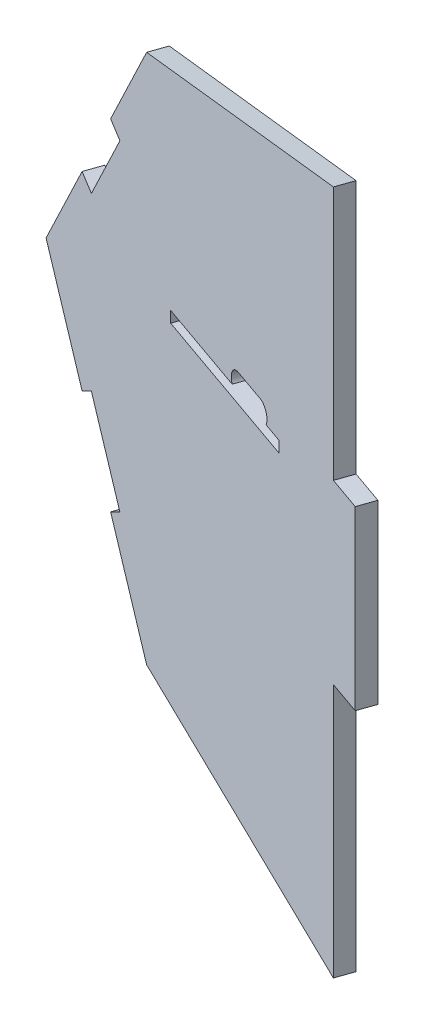
ISO-10303-21;
HEADER;
FILE_DESCRIPTION(('STEP AP214'),'2;1');
FILE_NAME('part.step','',(''),(''),'','','');
FILE_SCHEMA(('AUTOMOTIVE_DESIGN { 1 0 10303 214 1 1 1 1 }'));
ENDSEC;
DATA;
#1=APPLICATION_CONTEXT('core data for automotive mechanical design processes');
#2=APPLICATION_PROTOCOL_DEFINITION('international standard','automotive_design',2000,#1);
#3=PRODUCT_CONTEXT('',#1,'mechanical');
#4=PRODUCT('Part','Part','',(#3));
#5=PRODUCT_RELATED_PRODUCT_CATEGORY('part','',(#4));
#6=PRODUCT_DEFINITION_FORMATION('','',#4);
#7=PRODUCT_DEFINITION_CONTEXT('part definition',#1,'design');
#8=PRODUCT_DEFINITION('design','',#6,#7);
#9=PRODUCT_DEFINITION_SHAPE('','',#8);
#10=(LENGTH_UNIT() NAMED_UNIT(*) SI_UNIT(.MILLI.,.METRE.));
#11=(NAMED_UNIT(*) PLANE_ANGLE_UNIT() SI_UNIT($,.RADIAN.));
#12=(NAMED_UNIT(*) SI_UNIT($,.STERADIAN.) SOLID_ANGLE_UNIT());
#13=UNCERTAINTY_MEASURE_WITH_UNIT(LENGTH_MEASURE(1.E-05),#10,'distance_accuracy_value','');
#14=(GEOMETRIC_REPRESENTATION_CONTEXT(3) GLOBAL_UNCERTAINTY_ASSIGNED_CONTEXT((#13)) GLOBAL_UNIT_ASSIGNED_CONTEXT((#10,
#11,#12)) REPRESENTATION_CONTEXT('',''));
#15=CARTESIAN_POINT('',(0.,0.,0.));
#16=DIRECTION('',(0.,0.,1.));
#17=DIRECTION('',(1.,0.,0.));
#18=AXIS2_PLACEMENT_3D('',#15,#16,#17);
#19=CARTESIAN_POINT('',(-86.2192557629141,-58.7375000000007,246.340730751183));
#20=DIRECTION('',(0.,-1.,0.));
#21=DIRECTION('',(1.,0.,0.));
#22=AXIS2_PLACEMENT_3D('',#19,#20,#21);
#23=PLANE('',#22);
#24=DIRECTION('',(0.943858356366017,0.,0.330350424728106));
#25=VECTOR('',#24,1.);
#26=CARTESIAN_POINT('',(-87.910022271715,-58.7375000000007,251.1714922049));
#27=LINE('',#26,#25);
#28=CARTESIAN_POINT('',(-575.545967959133,-58.7375,80.4989112143034));
#29=VERTEX_POINT('',#28);
#30=CARTESIAN_POINT('',(-565.752740296912,-58.7375,83.926540896081));
#31=VERTEX_POINT('',#30);
#32=EDGE_CURVE('E390',#29,#31,#27,.T.);
#33=ORIENTED_EDGE('',*,*,#32,.F.);
#34=DIRECTION('',(-0.330350424728106,0.,0.943858356366017));
#35=VECTOR('',#34,1.);
#36=CARTESIAN_POINT('',(-573.855201450332,-58.7375,75.6681497605865));
#37=LINE('',#36,#35);
#38=CARTESIAN_POINT('',(-573.855201450332,-58.7375,75.6681497605865));
#39=VERTEX_POINT('',#38);
#40=EDGE_CURVE('E11',#39,#29,#37,.T.);
#41=ORIENTED_EDGE('',*,*,#40,.F.);
#42=DIRECTION('',(0.943858356366017,0.,0.330350424728106));
#43=VECTOR('',#42,1.);
#44=CARTESIAN_POINT('',(-86.2192557629141,-58.7375000000007,246.340730751183));
#45=LINE('',#44,#43);
#46=CARTESIAN_POINT('',(-564.061973788111,-58.7375,79.095779442364));
#47=VERTEX_POINT('',#46);
#48=EDGE_CURVE('E242',#39,#47,#45,.T.);
#49=ORIENTED_EDGE('',*,*,#48,.T.);
#50=DIRECTION('',(-0.330350424728106,0.,0.943858356366017));
#51=VECTOR('',#50,1.);
#52=CARTESIAN_POINT('',(-564.061973788111,-58.7375,79.095779442364));
#53=LINE('',#52,#51);
#54=EDGE_CURVE('E302',#47,#31,#53,.T.);
#55=ORIENTED_EDGE('',*,*,#54,.T.);
#56=EDGE_LOOP('',(#33,#41,#49,#55));
#57=FACE_BOUND('',#56,.T.);
#58=ADVANCED_FACE('F35',(#57),#23,.T.);
#59=CARTESIAN_POINT('',(-573.855201450332,-61.9125,75.6681497605865));
#60=DIRECTION('',(-0.330350424728106,0.,0.943858356366017));
#61=DIRECTION('',(0.943858356366017,0.,0.330350424728106));
#62=AXIS2_PLACEMENT_3D('',#59,#60,#61);
#63=CYLINDRICAL_SURFACE('',#62,3.17499999999999);
#64=CARTESIAN_POINT('',(-575.545967959133,-61.9125,80.4989112143035));
#65=DIRECTION('',(-0.330350424728106,0.,0.943858356366017));
#66=DIRECTION('',(0.943858356366017,0.,0.330350424728106));
#67=AXIS2_PLACEMENT_3D('',#64,#65,#66);
#68=CIRCLE('',#67,3.17499999999999);
#69=CARTESIAN_POINT('',(-578.141229831678,-63.5,79.5905695589129));
#70=VERTEX_POINT('',#69);
#71=EDGE_CURVE('E284',#29,#70,#68,.T.);
#72=ORIENTED_EDGE('',*,*,#71,.T.);
#73=DIRECTION('',(-0.330350424728106,0.,0.943858356366017));
#74=VECTOR('',#73,1.);
#75=CARTESIAN_POINT('',(-576.450463322877,-63.5,74.759808105196));
#76=LINE('',#75,#74);
#77=CARTESIAN_POINT('',(-576.450463322877,-63.5,74.759808105196));
#78=VERTEX_POINT('',#77);
#79=EDGE_CURVE('E45',#78,#70,#76,.T.);
#80=ORIENTED_EDGE('',*,*,#79,.F.);
#81=CARTESIAN_POINT('',(-573.855201450332,-61.9125,75.6681497605865));
#82=DIRECTION('',(-0.330350424728106,0.,0.943858356366017));
#83=DIRECTION('',(0.943858356366017,0.,0.330350424728106));
#84=AXIS2_PLACEMENT_3D('',#81,#82,#83);
#85=CIRCLE('',#84,3.17499999999999);
#86=EDGE_CURVE('E229',#39,#78,#85,.T.);
#87=ORIENTED_EDGE('',*,*,#86,.F.);
#88=ORIENTED_EDGE('',*,*,#40,.T.);
#89=EDGE_LOOP('',(#72,#80,#87,#88));
#90=FACE_BOUND('',#89,.T.);
#91=ADVANCED_FACE('F414',(#90),#63,.F.);
#92=CARTESIAN_POINT('',(-86.2192557629141,-63.5000000000001,246.340730751183));
#93=DIRECTION('',(0.,-1.,0.));
#94=DIRECTION('',(1.,0.,0.));
#95=AXIS2_PLACEMENT_3D('',#92,#93,#94);
#96=PLANE('',#95);
#97=DIRECTION('',(0.943858356366017,0.,0.330350424728106));
#98=VECTOR('',#97,1.);
#99=CARTESIAN_POINT('',(-87.910022271715,-63.5000000000001,251.1714922049));
#100=LINE('',#99,#98);
#101=CARTESIAN_POINT('',(-605.322006755091,-63.5,70.0772976357184));
#102=VERTEX_POINT('',#101);
#103=EDGE_CURVE('E213',#102,#70,#100,.T.);
#104=ORIENTED_EDGE('',*,*,#103,.F.);
#105=DIRECTION('',(-0.330350424728106,0.,0.943858356366017));
#106=VECTOR('',#105,1.);
#107=CARTESIAN_POINT('',(-603.63124024629,-63.5,65.2465361820015));
#108=LINE('',#107,#106);
#109=CARTESIAN_POINT('',(-603.63124024629,-63.5,65.2465361820015));
#110=VERTEX_POINT('',#109);
#111=EDGE_CURVE('E207',#110,#102,#108,.T.);
#112=ORIENTED_EDGE('',*,*,#111,.F.);
#113=DIRECTION('',(0.943858356366017,0.,0.330350424728106));
#114=VECTOR('',#113,1.);
#115=CARTESIAN_POINT('',(-86.2192557629141,-63.5000000000001,246.340730751183));
#116=LINE('',#115,#114);
#117=EDGE_CURVE('E211',#110,#78,#116,.T.);
#118=ORIENTED_EDGE('',*,*,#117,.T.);
#119=ORIENTED_EDGE('',*,*,#79,.T.);
#120=EDGE_LOOP('',(#104,#112,#118,#119));
#121=FACE_BOUND('',#120,.T.);
#122=ADVANCED_FACE('F209',(#121),#96,.T.);
#123=CARTESIAN_POINT('',(-603.63124024629,0.,65.2465361820014));
#124=DIRECTION('',(-0.943858356366017,0.,-0.330350424728106));
#125=DIRECTION('',(-0.330350424728106,0.,0.943858356366017));
#126=AXIS2_PLACEMENT_3D('',#123,#124,#125);
#127=PLANE('',#126);
#128=DIRECTION('',(0.,-1.,0.));
#129=VECTOR('',#128,1.);
#130=CARTESIAN_POINT('',(-605.322006755091,0.,70.0772976357183));
#131=LINE('',#130,#129);
#132=CARTESIAN_POINT('',(-605.322006755091,-66.675,70.0772976357183));
#133=VERTEX_POINT('',#132);
#134=EDGE_CURVE('E288',#102,#133,#131,.T.);
#135=ORIENTED_EDGE('',*,*,#134,.T.);
#136=DIRECTION('',(-0.330350424728106,0.,0.943858356366017));
#137=VECTOR('',#136,1.);
#138=CARTESIAN_POINT('',(-603.63124024629,-66.675,65.2465361820014));
#139=LINE('',#138,#137);
#140=CARTESIAN_POINT('',(-603.63124024629,-66.675,65.2465361820014));
#141=VERTEX_POINT('',#140);
#142=EDGE_CURVE('E217',#141,#133,#139,.T.);
#143=ORIENTED_EDGE('',*,*,#142,.F.);
#144=DIRECTION('',(0.,-1.,0.));
#145=VECTOR('',#144,1.);
#146=CARTESIAN_POINT('',(-603.63124024629,0.,65.2465361820014));
#147=LINE('',#146,#145);
#148=EDGE_CURVE('E221',#110,#141,#147,.T.);
#149=ORIENTED_EDGE('',*,*,#148,.F.);
#150=ORIENTED_EDGE('',*,*,#111,.T.);
#151=EDGE_LOOP('',(#135,#143,#149,#150));
#152=FACE_BOUND('',#151,.T.);
#153=ADVANCED_FACE('F222',(#152),#127,.F.);
#154=CARTESIAN_POINT('',(-86.219255762914,-66.675,246.340730751183));
#155=DIRECTION('',(0.,-1.,0.));
#156=DIRECTION('',(0.,0.,-1.));
#157=AXIS2_PLACEMENT_3D('',#154,#155,#156);
#158=PLANE('',#157);
#159=DIRECTION('',(0.943858356366017,0.,0.330350424728106));
#160=VECTOR('',#159,1.);
#161=CARTESIAN_POINT('',(-87.910022271715,-66.675,251.1714922049));
#162=LINE('',#161,#160);
#163=CARTESIAN_POINT('',(-557.374002251697,-66.675,86.8590992119062));
#164=VERTEX_POINT('',#163);
#165=EDGE_CURVE('E399',#133,#164,#162,.T.);
#166=ORIENTED_EDGE('',*,*,#165,.T.);
#167=DIRECTION('',(-0.330350424728106,0.,0.943858356366017));
#168=VECTOR('',#167,1.);
#169=CARTESIAN_POINT('',(-555.683235742896,-66.675,82.0283377581893));
#170=LINE('',#169,#168);
#171=CARTESIAN_POINT('',(-555.683235742896,-66.675,82.0283377581893));
#172=VERTEX_POINT('',#171);
#173=EDGE_CURVE('E296',#172,#164,#170,.T.);
#174=ORIENTED_EDGE('',*,*,#173,.F.);
#175=DIRECTION('',(0.943858356366017,0.,0.330350424728106));
#176=VECTOR('',#175,1.);
#177=CARTESIAN_POINT('',(-86.219255762914,-66.675,246.340730751183));
#178=LINE('',#177,#176);
#179=EDGE_CURVE('E225',#141,#172,#178,.T.);
#180=ORIENTED_EDGE('',*,*,#179,.F.);
#181=ORIENTED_EDGE('',*,*,#142,.T.);
#182=EDGE_LOOP('',(#166,#174,#180,#181));
#183=FACE_BOUND('',#182,.T.);
#184=ADVANCED_FACE('F404',(#183),#158,.F.);
#185=CARTESIAN_POINT('',(-555.683235742896,0.,82.0283377581893));
#186=DIRECTION('',(-0.943858356366017,0.,-0.330350424728106));
#187=DIRECTION('',(-0.330350424728106,0.,0.943858356366017));
#188=AXIS2_PLACEMENT_3D('',#185,#186,#187);
#189=PLANE('',#188);
#190=DIRECTION('',(0.,-1.,0.));
#191=VECTOR('',#190,1.);
#192=CARTESIAN_POINT('',(-557.374002251697,0.,86.8590992119062));
#193=LINE('',#192,#191);
#194=CARTESIAN_POINT('',(-557.374002251697,-63.5,86.8590992119062));
#195=VERTEX_POINT('',#194);
#196=EDGE_CURVE('E397',#195,#164,#193,.T.);
#197=ORIENTED_EDGE('',*,*,#196,.F.);
#198=DIRECTION('',(-0.330350424728106,0.,0.943858356366017));
#199=VECTOR('',#198,1.);
#200=CARTESIAN_POINT('',(-555.683235742896,-63.5,82.0283377581893));
#201=LINE('',#200,#199);
#202=CARTESIAN_POINT('',(-555.683235742896,-63.5,82.0283377581893));
#203=VERTEX_POINT('',#202);
#204=EDGE_CURVE('E298',#203,#195,#201,.T.);
#205=ORIENTED_EDGE('',*,*,#204,.F.);
#206=DIRECTION('',(0.,-1.,0.));
#207=VECTOR('',#206,1.);
#208=CARTESIAN_POINT('',(-555.683235742896,0.,82.0283377581893));
#209=LINE('',#208,#207);
#210=EDGE_CURVE('E236',#203,#172,#209,.T.);
#211=ORIENTED_EDGE('',*,*,#210,.T.);
#212=ORIENTED_EDGE('',*,*,#173,.T.);
#213=EDGE_LOOP('',(#197,#205,#211,#212));
#214=FACE_BOUND('',#213,.T.);
#215=ADVANCED_FACE('F408',(#214),#189,.T.);
#216=CARTESIAN_POINT('',(-563.157478424367,-63.5,84.8348825514716));
#217=VERTEX_POINT('',#216);
#218=EDGE_CURVE('E290',#217,#195,#100,.T.);
#219=ORIENTED_EDGE('',*,*,#218,.F.);
#220=DIRECTION('',(-0.330350424728106,0.,0.943858356366017));
#221=VECTOR('',#220,1.);
#222=CARTESIAN_POINT('',(-561.466711915566,-63.5,80.0041210977547));
#223=LINE('',#222,#221);
#224=CARTESIAN_POINT('',(-561.466711915566,-63.5,80.0041210977547));
#225=VERTEX_POINT('',#224);
#226=EDGE_CURVE('E300',#225,#217,#223,.T.);
#227=ORIENTED_EDGE('',*,*,#226,.F.);
#228=EDGE_CURVE('E231',#225,#203,#116,.T.);
#229=ORIENTED_EDGE('',*,*,#228,.T.);
#230=ORIENTED_EDGE('',*,*,#204,.T.);
#231=EDGE_LOOP('',(#219,#227,#229,#230));
#232=FACE_BOUND('',#231,.T.);
#233=ADVANCED_FACE('F410',(#232),#96,.T.);
#234=CARTESIAN_POINT('',(-116.797767047269,127.490550261987,235.638251801659));
#235=DIRECTION('',(-0.232461080785184,0.969196663245085,-0.0813613782748144));
#236=DIRECTION('',(-0.972420560882724,-0.233234330175743,0.));
#237=AXIS2_PLACEMENT_3D('',#234,#235,#236);
#238=PLANE('',#237);
#239=DIRECTION('',(-0.914784369565934,-0.246288099498521,-0.320174529348077));
#240=VECTOR('',#239,1.);
#241=CARTESIAN_POINT('',(-118.48853355607,127.490550261987,240.469013255376));
#242=LINE('',#241,#240);
#243=CARTESIAN_POINT('',(-533.4,15.7836169886208,95.2500000000002));
#244=VERTEX_POINT('',#243);
#245=CARTESIAN_POINT('',(-615.95,-6.44138301137928,66.3575));
#246=VERTEX_POINT('',#245);
#247=EDGE_CURVE('E341',#244,#246,#242,.T.);
#248=ORIENTED_EDGE('',*,*,#247,.F.);
#249=DIRECTION('',(-0.330350424728106,0.,0.943858356366017));
#250=VECTOR('',#249,1.);
#251=CARTESIAN_POINT('',(-531.709233491199,15.7836169886208,90.4192385462833));
#252=LINE('',#251,#250);
#253=CARTESIAN_POINT('',(-531.709233491199,15.7836169886208,90.4192385462833));
#254=VERTEX_POINT('',#253);
#255=EDGE_CURVE('E304',#254,#244,#252,.T.);
#256=ORIENTED_EDGE('',*,*,#255,.F.);
#257=DIRECTION('',(-0.914784369565934,-0.246288099498521,-0.320174529348077));
#258=VECTOR('',#257,1.);
#259=CARTESIAN_POINT('',(-116.797767047269,127.490550261987,235.638251801659));
#260=LINE('',#259,#258);
#261=CARTESIAN_POINT('',(-614.259233491199,-6.44138301137928,61.5267385462831));
#262=VERTEX_POINT('',#261);
#263=EDGE_CURVE('E282',#254,#262,#260,.T.);
#264=ORIENTED_EDGE('',*,*,#263,.T.);
#265=DIRECTION('',(-0.330350424728106,0.,0.943858356366017));
#266=VECTOR('',#265,1.);
#267=CARTESIAN_POINT('',(-614.259233491199,-6.44138301137928,61.5267385462831));
#268=LINE('',#267,#266);
#269=EDGE_CURVE('E39',#262,#246,#268,.T.);
#270=ORIENTED_EDGE('',*,*,#269,.T.);
#271=EDGE_LOOP('',(#248,#256,#264,#270));
#272=FACE_BOUND('',#271,.T.);
#273=ADVANCED_FACE('F37',(#272),#238,.T.);
#274=CARTESIAN_POINT('',(-531.709233491199,0.,90.4192385462832));
#275=DIRECTION('',(0.943858356366017,0.,0.330350424728106));
#276=DIRECTION('',(0.330350424728106,0.,-0.943858356366017));
#277=AXIS2_PLACEMENT_3D('',#274,#275,#276);
#278=PLANE('',#277);
#279=DIRECTION('',(0.,1.,0.));
#280=VECTOR('',#279,1.);
#281=CARTESIAN_POINT('',(-533.4,0.,95.2500000000001));
#282=LINE('',#281,#280);
#283=CARTESIAN_POINT('',(-533.4,-57.2413830113792,95.2500000000001));
#284=VERTEX_POINT('',#283);
#285=EDGE_CURVE('E355',#284,#244,#282,.T.);
#286=ORIENTED_EDGE('',*,*,#285,.F.);
#287=DIRECTION('',(-0.330350424728106,0.,0.943858356366017));
#288=VECTOR('',#287,1.);
#289=CARTESIAN_POINT('',(-531.709233491199,-57.2413830113792,90.4192385462832));
#290=LINE('',#289,#288);
#291=CARTESIAN_POINT('',(-531.709233491199,-57.2413830113792,90.4192385462832));
#292=VERTEX_POINT('',#291);
#293=EDGE_CURVE('E306',#292,#284,#290,.T.);
#294=ORIENTED_EDGE('',*,*,#293,.F.);
#295=DIRECTION('',(0.,1.,0.));
#296=VECTOR('',#295,1.);
#297=CARTESIAN_POINT('',(-531.709233491199,0.,90.4192385462832));
#298=LINE('',#297,#296);
#299=EDGE_CURVE('E245',#292,#254,#298,.T.);
#300=ORIENTED_EDGE('',*,*,#299,.T.);
#301=ORIENTED_EDGE('',*,*,#255,.T.);
#302=EDGE_LOOP('',(#286,#294,#300,#301));
#303=FACE_BOUND('',#302,.T.);
#304=ADVANCED_FACE('F423',(#303),#278,.T.);
#305=CARTESIAN_POINT('',(-86.219255762914,-57.2413830113792,246.340730751183));
#306=DIRECTION('',(0.,-1.,0.));
#307=DIRECTION('',(0.,0.,-1.));
#308=AXIS2_PLACEMENT_3D('',#305,#306,#307);
#309=PLANE('',#308);
#310=DIRECTION('',(0.943858356366017,0.,0.330350424728106));
#311=VECTOR('',#310,1.);
#312=CARTESIAN_POINT('',(-87.910022271715,-57.2413830113792,251.1714922049));
#313=LINE('',#312,#311);
#314=CARTESIAN_POINT('',(-523.738477092566,-57.2413830113792,98.6315330176019));
#315=VERTEX_POINT('',#314);
#316=EDGE_CURVE('E388',#284,#315,#313,.T.);
#317=ORIENTED_EDGE('',*,*,#316,.T.);
#318=DIRECTION('',(-0.330350424728106,0.,0.943858356366017));
#319=VECTOR('',#318,1.);
#320=CARTESIAN_POINT('',(-522.047710583765,-57.2413830113792,93.800771563885));
#321=LINE('',#320,#319);
#322=CARTESIAN_POINT('',(-522.047710583765,-57.2413830113792,93.800771563885));
#323=VERTEX_POINT('',#322);
#324=EDGE_CURVE('E308',#323,#315,#321,.T.);
#325=ORIENTED_EDGE('',*,*,#324,.F.);
#326=DIRECTION('',(0.943858356366017,0.,0.330350424728106));
#327=VECTOR('',#326,1.);
#328=CARTESIAN_POINT('',(-86.219255762914,-57.2413830113792,246.340730751183));
#329=LINE('',#328,#327);
#330=EDGE_CURVE('E248',#292,#323,#329,.T.);
#331=ORIENTED_EDGE('',*,*,#330,.F.);
#332=ORIENTED_EDGE('',*,*,#293,.T.);
#333=EDGE_LOOP('',(#317,#325,#331,#332));
#334=FACE_BOUND('',#333,.T.);
#335=ADVANCED_FACE('F426',(#334),#309,.F.);
#336=CARTESIAN_POINT('',(-522.047710583765,0.,93.800771563885));
#337=DIRECTION('',(-0.943858356366017,0.,-0.330350424728106));
#338=DIRECTION('',(-0.330350424728106,0.,0.943858356366017));
#339=AXIS2_PLACEMENT_3D('',#336,#337,#338);
#340=PLANE('',#339);
#341=DIRECTION('',(0.,-1.,0.));
#342=VECTOR('',#341,1.);
#343=CARTESIAN_POINT('',(-523.738477092566,0.,98.6315330176019));
#344=LINE('',#343,#342);
#345=CARTESIAN_POINT('',(-523.738477092566,-108.041383011379,98.6315330176019));
#346=VERTEX_POINT('',#345);
#347=EDGE_CURVE('E385',#315,#346,#344,.T.);
#348=ORIENTED_EDGE('',*,*,#347,.T.);
#349=DIRECTION('',(-0.330350424728106,0.,0.943858356366017));
#350=VECTOR('',#349,1.);
#351=CARTESIAN_POINT('',(-522.047710583765,-108.041383011379,93.800771563885));
#352=LINE('',#351,#350);
#353=CARTESIAN_POINT('',(-522.047710583765,-108.041383011379,93.800771563885));
#354=VERTEX_POINT('',#353);
#355=EDGE_CURVE('E311',#354,#346,#352,.T.);
#356=ORIENTED_EDGE('',*,*,#355,.F.);
#357=DIRECTION('',(0.,-1.,0.));
#358=VECTOR('',#357,1.);
#359=CARTESIAN_POINT('',(-522.047710583765,0.,93.800771563885));
#360=LINE('',#359,#358);
#361=EDGE_CURVE('E250',#323,#354,#360,.T.);
#362=ORIENTED_EDGE('',*,*,#361,.F.);
#363=ORIENTED_EDGE('',*,*,#324,.T.);
#364=EDGE_LOOP('',(#348,#356,#362,#363));
#365=FACE_BOUND('',#364,.T.);
#366=ADVANCED_FACE('F431',(#365),#340,.F.);
#367=CARTESIAN_POINT('',(-86.219255762914,-108.041383011379,246.340730751183));
#368=DIRECTION('',(0.,-1.,0.));
#369=DIRECTION('',(0.,0.,-1.));
#370=AXIS2_PLACEMENT_3D('',#367,#368,#369);
#371=PLANE('',#370);
#372=DIRECTION('',(0.943858356366017,0.,0.330350424728106));
#373=VECTOR('',#372,1.);
#374=CARTESIAN_POINT('',(-87.910022271715,-108.041383011379,251.1714922049));
#375=LINE('',#374,#373);
#376=CARTESIAN_POINT('',(-533.4,-108.041383011379,95.2500000000001));
#377=VERTEX_POINT('',#376);
#378=EDGE_CURVE('E382',#377,#346,#375,.T.);
#379=ORIENTED_EDGE('',*,*,#378,.F.);
#380=DIRECTION('',(-0.330350424728106,0.,0.943858356366017));
#381=VECTOR('',#380,1.);
#382=CARTESIAN_POINT('',(-531.709233491199,-108.041383011379,90.4192385462832));
#383=LINE('',#382,#381);
#384=CARTESIAN_POINT('',(-531.709233491199,-108.041383011379,90.4192385462832));
#385=VERTEX_POINT('',#384);
#386=EDGE_CURVE('E313',#385,#377,#383,.T.);
#387=ORIENTED_EDGE('',*,*,#386,.F.);
#388=DIRECTION('',(0.943858356366017,0.,0.330350424728106));
#389=VECTOR('',#388,1.);
#390=CARTESIAN_POINT('',(-86.219255762914,-108.041383011379,246.340730751183));
#391=LINE('',#390,#389);
#392=EDGE_CURVE('E252',#385,#354,#391,.T.);
#393=ORIENTED_EDGE('',*,*,#392,.T.);
#394=ORIENTED_EDGE('',*,*,#355,.T.);
#395=EDGE_LOOP('',(#379,#387,#393,#394));
#396=FACE_BOUND('',#395,.T.);
#397=ADVANCED_FACE('F435',(#396),#371,.T.);
#398=CARTESIAN_POINT('',(-533.4,-181.066383011379,95.2500000000001));
#399=VERTEX_POINT('',#398);
#400=EDGE_CURVE('E379',#399,#377,#282,.T.);
#401=ORIENTED_EDGE('',*,*,#400,.F.);
#402=DIRECTION('',(-0.330350424728106,0.,0.943858356366017));
#403=VECTOR('',#402,1.);
#404=CARTESIAN_POINT('',(-531.709233491199,-181.066383011379,90.4192385462832));
#405=LINE('',#404,#403);
#406=CARTESIAN_POINT('',(-531.709233491199,-181.066383011379,90.4192385462832));
#407=VERTEX_POINT('',#406);
#408=EDGE_CURVE('E315',#407,#399,#405,.T.);
#409=ORIENTED_EDGE('',*,*,#408,.F.);
#410=EDGE_CURVE('E255',#407,#385,#298,.T.);
#411=ORIENTED_EDGE('',*,*,#410,.T.);
#412=ORIENTED_EDGE('',*,*,#386,.T.);
#413=EDGE_LOOP('',(#401,#409,#411,#412));
#414=FACE_BOUND('',#413,.T.);
#415=ADVANCED_FACE('F428',(#414),#278,.T.);
#416=CARTESIAN_POINT('',(-154.036057506835,-282.747622699477,222.60485014081));
#417=DIRECTION('',(-0.232461080785184,-0.969196663245085,-0.0813613782748145));
#418=DIRECTION('',(0.972420560882724,-0.233234330175744,0.));
#419=AXIS2_PLACEMENT_3D('',#416,#417,#418);
#420=PLANE('',#419);
#421=DIRECTION('',(0.914784369565934,-0.246288099498521,0.320174529348077));
#422=VECTOR('',#421,1.);
#423=CARTESIAN_POINT('',(-155.726824015636,-282.747622699477,227.435611594527));
#424=LINE('',#423,#422);
#425=CARTESIAN_POINT('',(-615.95,-158.841383011379,66.3575000000001));
#426=VERTEX_POINT('',#425);
#427=EDGE_CURVE('E376',#426,#399,#424,.T.);
#428=ORIENTED_EDGE('',*,*,#427,.F.);
#429=DIRECTION('',(-0.330350424728106,0.,0.943858356366017));
#430=VECTOR('',#429,1.);
#431=CARTESIAN_POINT('',(-614.259233491199,-158.841383011379,61.5267385462832));
#432=LINE('',#431,#430);
#433=CARTESIAN_POINT('',(-614.259233491199,-158.841383011379,61.5267385462832));
#434=VERTEX_POINT('',#433);
#435=EDGE_CURVE('E317',#434,#426,#432,.T.);
#436=ORIENTED_EDGE('',*,*,#435,.F.);
#437=DIRECTION('',(0.914784369565934,-0.246288099498521,0.320174529348077));
#438=VECTOR('',#437,1.);
#439=CARTESIAN_POINT('',(-154.036057506835,-282.747622699477,222.60485014081));
#440=LINE('',#439,#438);
#441=EDGE_CURVE('E258',#434,#407,#440,.T.);
#442=ORIENTED_EDGE('',*,*,#441,.T.);
#443=ORIENTED_EDGE('',*,*,#408,.T.);
#444=EDGE_LOOP('',(#428,#436,#442,#443));
#445=FACE_BOUND('',#444,.T.);
#446=ADVANCED_FACE('F440',(#445),#420,.T.);
#447=CARTESIAN_POINT('',(-535.361517623086,-294.094610213858,89.1409391001228));
#448=DIRECTION('',(-0.802895095526454,-0.525729017758259,-0.281013283434259));
#449=DIRECTION('',(0.547803368830947,-0.836607117527377,0.));
#450=AXIS2_PLACEMENT_3D('',#447,#448,#449);
#451=PLANE('',#450);
#452=DIRECTION('',(0.496213726595231,-0.850652102734682,0.173674804308331));
#453=VECTOR('',#452,1.);
#454=CARTESIAN_POINT('',(-537.052284131887,-294.094610213858,93.9717005538397));
#455=LINE('',#454,#453);
#456=CARTESIAN_POINT('',(-631.873085672241,-131.54466471611,60.7844200147159));
#457=VERTEX_POINT('',#456);
#458=EDGE_CURVE('E368',#457,#426,#455,.T.);
#459=ORIENTED_EDGE('',*,*,#458,.F.);
#460=DIRECTION('',(-0.330350424728106,0.,0.943858356366017));
#461=VECTOR('',#460,1.);
#462=CARTESIAN_POINT('',(-630.18231916344,-131.54466471611,55.953658560999));
#463=LINE('',#462,#461);
#464=CARTESIAN_POINT('',(-630.18231916344,-131.54466471611,55.953658560999));
#465=VERTEX_POINT('',#464);
#466=EDGE_CURVE('E319',#465,#457,#463,.T.);
#467=ORIENTED_EDGE('',*,*,#466,.F.);
#468=DIRECTION('',(0.496213726595231,-0.850652102734682,0.173674804308331));
#469=VECTOR('',#468,1.);
#470=CARTESIAN_POINT('',(-535.361517623086,-294.094610213858,89.1409391001228));
#471=LINE('',#470,#469);
#472=EDGE_CURVE('E261',#465,#434,#471,.T.);
#473=ORIENTED_EDGE('',*,*,#472,.T.);
#474=ORIENTED_EDGE('',*,*,#435,.T.);
#475=EDGE_LOOP('',(#459,#467,#473,#474));
#476=FACE_BOUND('',#475,.T.);
#477=ADVANCED_FACE('F443',(#476),#451,.T.);
#478=CARTESIAN_POINT('',(-181.040057303268,162.549945497749,213.153450212059));
#479=DIRECTION('',(0.496213726595232,-0.850652102734682,0.173674804308331));
#480=DIRECTION('',(0.863778900898433,0.503871025524087,0.));
#481=AXIS2_PLACEMENT_3D('',#478,#479,#480);
#482=PLANE('',#481);
#483=DIRECTION('',(0.802895095526453,0.52572901775826,0.281013283434259));
#484=VECTOR('',#483,1.);
#485=CARTESIAN_POINT('',(-182.730823812069,162.549945497749,217.984211665776));
#486=LINE('',#485,#484);
#487=CARTESIAN_POINT('',(-627.763788283827,-128.853931030321,62.2226741006608));
#488=VERTEX_POINT('',#487);
#489=EDGE_CURVE('E374',#457,#488,#486,.T.);
#490=ORIENTED_EDGE('',*,*,#489,.T.);
#491=DIRECTION('',(-0.330350424728106,0.,0.943858356366017));
#492=VECTOR('',#491,1.);
#493=CARTESIAN_POINT('',(-626.073021775025,-128.853931030321,57.3919126469439));
#494=LINE('',#493,#492);
#495=CARTESIAN_POINT('',(-626.073021775025,-128.853931030321,57.3919126469439));
#496=VERTEX_POINT('',#495);
#497=EDGE_CURVE('E321',#496,#488,#494,.T.);
#498=ORIENTED_EDGE('',*,*,#497,.F.);
#499=DIRECTION('',(0.802895095526453,0.52572901775826,0.281013283434259));
#500=VECTOR('',#499,1.);
#501=CARTESIAN_POINT('',(-181.040057303268,162.549945497749,213.153450212059));
#502=LINE('',#501,#500);
#503=EDGE_CURVE('E262',#465,#496,#502,.T.);
#504=ORIENTED_EDGE('',*,*,#503,.F.);
#505=ORIENTED_EDGE('',*,*,#466,.T.);
#506=EDGE_LOOP('',(#490,#498,#504,#505));
#507=FACE_BOUND('',#506,.T.);
#508=ADVANCED_FACE('F447',(#507),#482,.F.);
#509=CARTESIAN_POINT('',(-531.252220234672,-291.40387652807,90.5791931860677));
#510=DIRECTION('',(0.802895095526453,0.525729017758259,0.281013283434259));
#511=DIRECTION('',(-0.547803368830947,0.836607117527376,0.));
#512=AXIS2_PLACEMENT_3D('',#509,#510,#511);
#513=PLANE('',#512);
#514=DIRECTION('',(-0.496213726595232,0.850652102734682,-0.173674804308331));
#515=VECTOR('',#514,1.);
#516=CARTESIAN_POINT('',(-532.942986743473,-291.40387652807,95.4099546397846));
#517=LINE('',#516,#515);
#518=CARTESIAN_POINT('',(-640.367616939346,-107.24736762086,57.8113340712292));
#519=VERTEX_POINT('',#518);
#520=EDGE_CURVE('E371',#488,#519,#517,.T.);
#521=ORIENTED_EDGE('',*,*,#520,.T.);
#522=DIRECTION('',(-0.330350424728106,0.,0.943858356366017));
#523=VECTOR('',#522,1.);
#524=CARTESIAN_POINT('',(-638.676850430545,-107.24736762086,52.9805726175122));
#525=LINE('',#524,#523);
#526=CARTESIAN_POINT('',(-638.676850430545,-107.24736762086,52.9805726175122));
#527=VERTEX_POINT('',#526);
#528=EDGE_CURVE('E324',#527,#519,#525,.T.);
#529=ORIENTED_EDGE('',*,*,#528,.F.);
#530=DIRECTION('',(-0.496213726595232,0.850652102734682,-0.173674804308331));
#531=VECTOR('',#530,1.);
#532=CARTESIAN_POINT('',(-531.252220234672,-291.40387652807,90.5791931860677));
#533=LINE('',#532,#531);
#534=EDGE_CURVE('E264',#496,#527,#533,.T.);
#535=ORIENTED_EDGE('',*,*,#534,.F.);
#536=ORIENTED_EDGE('',*,*,#497,.T.);
#537=EDGE_LOOP('',(#521,#529,#535,#536));
#538=FACE_BOUND('',#537,.T.);
#539=ADVANCED_FACE('F452',(#538),#513,.F.);
#540=CARTESIAN_POINT('',(-193.643885958785,184.156508907209,208.742110182628));
#541=DIRECTION('',(0.496213726595229,-0.850652102734684,0.17367480430833));
#542=DIRECTION('',(0.863778900898435,0.503871025524084,0.));
#543=AXIS2_PLACEMENT_3D('',#540,#541,#542);
#544=PLANE('',#543);
#545=DIRECTION('',(0.802895095526455,0.525729017758257,0.281013283434259));
#546=VECTOR('',#545,1.);
#547=CARTESIAN_POINT('',(-195.334652467586,184.156508907209,213.572871636345));
#548=LINE('',#547,#546);
#549=CARTESIAN_POINT('',(-644.476914327759,-109.938101306649,56.3730799852843));
#550=VERTEX_POINT('',#549);
#551=EDGE_CURVE('E367',#550,#519,#548,.T.);
#552=ORIENTED_EDGE('',*,*,#551,.F.);
#553=DIRECTION('',(-0.330350424728106,0.,0.943858356366017));
#554=VECTOR('',#553,1.);
#555=CARTESIAN_POINT('',(-642.786147818959,-109.938101306649,51.5423185315674));
#556=LINE('',#555,#554);
#557=CARTESIAN_POINT('',(-642.786147818959,-109.938101306649,51.5423185315674));
#558=VERTEX_POINT('',#557);
#559=EDGE_CURVE('E326',#558,#550,#556,.T.);
#560=ORIENTED_EDGE('',*,*,#559,.F.);
#561=DIRECTION('',(0.802895095526455,0.525729017758257,0.281013283434259));
#562=VECTOR('',#561,1.);
#563=CARTESIAN_POINT('',(-193.643885958785,184.156508907209,208.742110182628));
#564=LINE('',#563,#562);
#565=EDGE_CURVE('E266',#558,#527,#564,.T.);
#566=ORIENTED_EDGE('',*,*,#565,.T.);
#567=ORIENTED_EDGE('',*,*,#528,.T.);
#568=EDGE_LOOP('',(#552,#560,#566,#567));
#569=FACE_BOUND('',#568,.T.);
#570=ADVANCED_FACE('F456',(#569),#544,.T.);
#571=CARTESIAN_POINT('',(-660.4,-82.641383011379,50.8000000000002));
#572=VERTEX_POINT('',#571);
#573=EDGE_CURVE('E364',#572,#550,#455,.T.);
#574=ORIENTED_EDGE('',*,*,#573,.F.);
#575=DIRECTION('',(-0.330350424728106,0.,0.943858356366017));
#576=VECTOR('',#575,1.);
#577=CARTESIAN_POINT('',(-658.709233491199,-82.641383011379,45.9692385462832));
#578=LINE('',#577,#576);
#579=CARTESIAN_POINT('',(-658.709233491199,-82.641383011379,45.9692385462832));
#580=VERTEX_POINT('',#579);
#581=EDGE_CURVE('E328',#580,#572,#578,.T.);
#582=ORIENTED_EDGE('',*,*,#581,.F.);
#583=EDGE_CURVE('E269',#580,#558,#471,.T.);
#584=ORIENTED_EDGE('',*,*,#583,.T.);
#585=ORIENTED_EDGE('',*,*,#559,.T.);
#586=EDGE_LOOP('',(#574,#582,#584,#585));
#587=FACE_BOUND('',#586,.T.);
#588=ADVANCED_FACE('F449',(#587),#451,.T.);
#589=CARTESIAN_POINT('',(-465.594794361259,248.411941211375,113.559292241762));
#590=DIRECTION('',(-0.802895095526454,0.525729017758259,-0.281013283434259));
#591=DIRECTION('',(-0.547803368830947,-0.836607117527377,0.));
#592=AXIS2_PLACEMENT_3D('',#589,#590,#591);
#593=PLANE('',#592);
#594=DIRECTION('',(-0.496213726595231,-0.850652102734682,-0.173674804308331));
#595=VECTOR('',#594,1.);
#596=CARTESIAN_POINT('',(-467.28556087006,248.411941211375,118.390053695479));
#597=LINE('',#596,#595);
#598=CARTESIAN_POINT('',(-644.47691432776,-55.3446647161096,56.3730799852843));
#599=VERTEX_POINT('',#598);
#600=EDGE_CURVE('E350',#599,#572,#597,.T.);
#601=ORIENTED_EDGE('',*,*,#600,.F.);
#602=DIRECTION('',(-0.330350424728106,0.,0.943858356366017));
#603=VECTOR('',#602,1.);
#604=CARTESIAN_POINT('',(-642.786147818959,-55.3446647161096,51.5423185315673));
#605=LINE('',#604,#603);
#606=CARTESIAN_POINT('',(-642.786147818959,-55.3446647161096,51.5423185315673));
#607=VERTEX_POINT('',#606);
#608=EDGE_CURVE('E330',#607,#599,#605,.T.);
#609=ORIENTED_EDGE('',*,*,#608,.F.);
#610=DIRECTION('',(-0.496213726595231,-0.850652102734682,-0.173674804308331));
#611=VECTOR('',#610,1.);
#612=CARTESIAN_POINT('',(-465.594794361259,248.411941211375,113.559292241762));
#613=LINE('',#612,#611);
#614=EDGE_CURVE('E272',#607,#580,#613,.T.);
#615=ORIENTED_EDGE('',*,*,#614,.T.);
#616=ORIENTED_EDGE('',*,*,#581,.T.);
#617=EDGE_LOOP('',(#601,#609,#615,#616));
#618=FACE_BOUND('',#617,.T.);
#619=ADVANCED_FACE('F461',(#618),#593,.T.);
#620=CARTESIAN_POINT('',(-263.410609220612,-303.756605927484,184.323757040989));
#621=DIRECTION('',(0.496213726595229,0.850652102734684,0.17367480430833));
#622=DIRECTION('',(-0.863778900898435,0.503871025524084,0.));
#623=AXIS2_PLACEMENT_3D('',#620,#621,#622);
#624=PLANE('',#623);
#625=DIRECTION('',(-0.802895095526455,0.525729017758257,-0.281013283434259));
#626=VECTOR('',#625,1.);
#627=CARTESIAN_POINT('',(-265.101375729413,-303.756605927484,189.154518494706));
#628=LINE('',#627,#626);
#629=CARTESIAN_POINT('',(-640.367616939346,-58.0353984018981,57.8113340712292));
#630=VERTEX_POINT('',#629);
#631=EDGE_CURVE('E361',#630,#599,#628,.T.);
#632=ORIENTED_EDGE('',*,*,#631,.F.);
#633=DIRECTION('',(-0.330350424728106,0.,0.943858356366017));
#634=VECTOR('',#633,1.);
#635=CARTESIAN_POINT('',(-638.676850430545,-58.0353984018981,52.9805726175122));
#636=LINE('',#635,#634);
#637=CARTESIAN_POINT('',(-638.676850430545,-58.0353984018981,52.9805726175122));
#638=VERTEX_POINT('',#637);
#639=EDGE_CURVE('E332',#638,#630,#636,.T.);
#640=ORIENTED_EDGE('',*,*,#639,.F.);
#641=DIRECTION('',(-0.802895095526455,0.525729017758257,-0.281013283434259));
#642=VECTOR('',#641,1.);
#643=CARTESIAN_POINT('',(-263.410609220612,-303.756605927484,184.323757040989));
#644=LINE('',#643,#642);
#645=EDGE_CURVE('E273',#638,#607,#644,.T.);
#646=ORIENTED_EDGE('',*,*,#645,.T.);
#647=ORIENTED_EDGE('',*,*,#608,.T.);
#648=EDGE_LOOP('',(#632,#640,#646,#647));
#649=FACE_BOUND('',#648,.T.);
#650=ADVANCED_FACE('F464',(#649),#624,.T.);
#651=CARTESIAN_POINT('',(-461.485496972845,245.721207525586,114.997546327707));
#652=DIRECTION('',(0.802895095526453,-0.525729017758259,0.281013283434259));
#653=DIRECTION('',(0.547803368830947,0.836607117527376,0.));
#654=AXIS2_PLACEMENT_3D('',#651,#652,#653);
#655=PLANE('',#654);
#656=DIRECTION('',(0.496213726595232,0.850652102734682,0.173674804308331));
#657=VECTOR('',#656,1.);
#658=CARTESIAN_POINT('',(-463.176263481646,245.721207525586,119.828307781424));
#659=LINE('',#658,#657);
#660=CARTESIAN_POINT('',(-627.763788283827,-36.4288349924372,62.2226741006607));
#661=VERTEX_POINT('',#660);
#662=EDGE_CURVE('E359',#630,#661,#659,.T.);
#663=ORIENTED_EDGE('',*,*,#662,.T.);
#664=DIRECTION('',(-0.330350424728106,0.,0.943858356366017));
#665=VECTOR('',#664,1.);
#666=CARTESIAN_POINT('',(-626.073021775026,-36.4288349924372,57.3919126469438));
#667=LINE('',#666,#665);
#668=CARTESIAN_POINT('',(-626.073021775026,-36.4288349924372,57.3919126469438));
#669=VERTEX_POINT('',#668);
#670=EDGE_CURVE('E334',#669,#661,#667,.T.);
#671=ORIENTED_EDGE('',*,*,#670,.F.);
#672=DIRECTION('',(0.496213726595232,0.850652102734682,0.173674804308331));
#673=VECTOR('',#672,1.);
#674=CARTESIAN_POINT('',(-461.485496972845,245.721207525586,114.997546327707));
#675=LINE('',#674,#673);
#676=EDGE_CURVE('E276',#638,#669,#675,.T.);
#677=ORIENTED_EDGE('',*,*,#676,.F.);
#678=ORIENTED_EDGE('',*,*,#639,.T.);
#679=EDGE_LOOP('',(#663,#671,#677,#678));
#680=FACE_BOUND('',#679,.T.);
#681=ADVANCED_FACE('F468',(#680),#655,.F.);
#682=CARTESIAN_POINT('',(-250.806780565093,-282.150042518023,188.73509707042));
#683=DIRECTION('',(0.496213726595228,0.850652102734684,0.17367480430833));
#684=DIRECTION('',(-0.863778900898435,0.503871025524083,0.));
#685=AXIS2_PLACEMENT_3D('',#682,#683,#684);
#686=PLANE('',#685);
#687=DIRECTION('',(-0.802895095526456,0.525729017758256,-0.281013283434259));
#688=VECTOR('',#687,1.);
#689=CARTESIAN_POINT('',(-252.497547073893,-282.150042518023,193.565858524137));
#690=LINE('',#689,#688);
#691=CARTESIAN_POINT('',(-631.873085672241,-33.7381013066487,60.7844200147159));
#692=VERTEX_POINT('',#691);
#693=EDGE_CURVE('E348',#661,#692,#690,.T.);
#694=ORIENTED_EDGE('',*,*,#693,.T.);
#695=DIRECTION('',(-0.330350424728106,0.,0.943858356366017));
#696=VECTOR('',#695,1.);
#697=CARTESIAN_POINT('',(-630.18231916344,-33.7381013066487,55.953658560999));
#698=LINE('',#697,#696);
#699=CARTESIAN_POINT('',(-630.18231916344,-33.7381013066487,55.953658560999));
#700=VERTEX_POINT('',#699);
#701=EDGE_CURVE('E336',#700,#692,#698,.T.);
#702=ORIENTED_EDGE('',*,*,#701,.F.);
#703=DIRECTION('',(-0.802895095526456,0.525729017758256,-0.281013283434259));
#704=VECTOR('',#703,1.);
#705=CARTESIAN_POINT('',(-250.806780565093,-282.150042518023,188.73509707042));
#706=LINE('',#705,#704);
#707=EDGE_CURVE('E278',#669,#700,#706,.T.);
#708=ORIENTED_EDGE('',*,*,#707,.F.);
#709=ORIENTED_EDGE('',*,*,#670,.T.);
#710=EDGE_LOOP('',(#694,#702,#708,#709));
#711=FACE_BOUND('',#710,.T.);
#712=ADVANCED_FACE('F471',(#711),#686,.F.);
#713=EDGE_CURVE('E344',#246,#692,#597,.T.);
#714=ORIENTED_EDGE('',*,*,#713,.F.);
#715=ORIENTED_EDGE('',*,*,#269,.F.);
#716=EDGE_CURVE('E280',#262,#700,#613,.T.);
#717=ORIENTED_EDGE('',*,*,#716,.T.);
#718=ORIENTED_EDGE('',*,*,#701,.T.);
#719=EDGE_LOOP('',(#714,#715,#717,#718));
#720=FACE_BOUND('',#719,.T.);
#721=ADVANCED_FACE('F345',(#720),#593,.T.);
#722=CARTESIAN_POINT('',(-564.061973788111,-61.9125,79.0957794423642));
#723=DIRECTION('',(-0.330350424728106,0.,0.943858356366017));
#724=DIRECTION('',(0.943858356366017,0.,0.330350424728106));
#725=AXIS2_PLACEMENT_3D('',#722,#723,#724);
#726=CYLINDRICAL_SURFACE('',#725,3.17500000000004);
#727=CARTESIAN_POINT('',(-565.752740296912,-61.9125,83.9265408960811));
#728=DIRECTION('',(-0.330350424728106,0.,0.943858356366017));
#729=DIRECTION('',(0.943858356366017,0.,0.330350424728106));
#730=AXIS2_PLACEMENT_3D('',#727,#728,#729);
#731=CIRCLE('',#730,3.17500000000004);
#732=EDGE_CURVE('E393',#31,#217,#731,.F.);
#733=ORIENTED_EDGE('',*,*,#732,.F.);
#734=ORIENTED_EDGE('',*,*,#54,.F.);
#735=CARTESIAN_POINT('',(-564.061973788111,-61.9125,79.0957794423642));
#736=DIRECTION('',(-0.330350424728106,0.,0.943858356366017));
#737=DIRECTION('',(0.943858356366017,0.,0.330350424728106));
#738=AXIS2_PLACEMENT_3D('',#735,#736,#737);
#739=CIRCLE('',#738,3.17500000000004);
#740=EDGE_CURVE('E237',#47,#225,#739,.F.);
#741=ORIENTED_EDGE('',*,*,#740,.T.);
#742=ORIENTED_EDGE('',*,*,#226,.T.);
#743=EDGE_LOOP('',(#733,#734,#741,#742));
#744=FACE_BOUND('',#743,.T.);
#745=ADVANCED_FACE('F412',(#744),#726,.F.);
#746=CARTESIAN_POINT('',(-86.219255762914,0.,246.340730751183));
#747=DIRECTION('',(-0.330350424728106,0.,0.943858356366017));
#748=DIRECTION('',(0.943858356366017,0.,0.330350424728106));
#749=AXIS2_PLACEMENT_3D('',#746,#747,#748);
#750=PLANE('',#749);
#751=ORIENTED_EDGE('',*,*,#263,.F.);
#752=ORIENTED_EDGE('',*,*,#299,.F.);
#753=ORIENTED_EDGE('',*,*,#330,.T.);
#754=ORIENTED_EDGE('',*,*,#361,.T.);
#755=ORIENTED_EDGE('',*,*,#392,.F.);
#756=ORIENTED_EDGE('',*,*,#410,.F.);
#757=ORIENTED_EDGE('',*,*,#441,.F.);
#758=ORIENTED_EDGE('',*,*,#472,.F.);
#759=ORIENTED_EDGE('',*,*,#503,.T.);
#760=ORIENTED_EDGE('',*,*,#534,.T.);
#761=ORIENTED_EDGE('',*,*,#565,.F.);
#762=ORIENTED_EDGE('',*,*,#583,.F.);
#763=ORIENTED_EDGE('',*,*,#614,.F.);
#764=ORIENTED_EDGE('',*,*,#645,.F.);
#765=ORIENTED_EDGE('',*,*,#676,.T.);
#766=ORIENTED_EDGE('',*,*,#707,.T.);
#767=ORIENTED_EDGE('',*,*,#716,.F.);
#768=EDGE_LOOP('',(#751,#752,#753,#754,#755,#756,#757,#758,#759,#760,#761,#762,#763,#764,#765,
#766,#767));
#769=FACE_BOUND('',#768,.T.);
#770=ORIENTED_EDGE('',*,*,#48,.F.);
#771=ORIENTED_EDGE('',*,*,#86,.T.);
#772=ORIENTED_EDGE('',*,*,#117,.F.);
#773=ORIENTED_EDGE('',*,*,#148,.T.);
#774=ORIENTED_EDGE('',*,*,#179,.T.);
#775=ORIENTED_EDGE('',*,*,#210,.F.);
#776=ORIENTED_EDGE('',*,*,#228,.F.);
#777=ORIENTED_EDGE('',*,*,#740,.F.);
#778=EDGE_LOOP('',(#770,#771,#772,#773,#774,#775,#776,#777));
#779=FACE_BOUND('',#778,.T.);
#780=ADVANCED_FACE('F228',(#769,#779),#750,.F.);
#781=CARTESIAN_POINT('',(-87.910022271715,0.,251.1714922049));
#782=DIRECTION('',(-0.330350424728106,0.,0.943858356366017));
#783=DIRECTION('',(0.943858356366017,0.,0.330350424728106));
#784=AXIS2_PLACEMENT_3D('',#781,#782,#783);
#785=PLANE('',#784);
#786=ORIENTED_EDGE('',*,*,#247,.T.);
#787=ORIENTED_EDGE('',*,*,#713,.T.);
#788=ORIENTED_EDGE('',*,*,#693,.F.);
#789=ORIENTED_EDGE('',*,*,#662,.F.);
#790=ORIENTED_EDGE('',*,*,#631,.T.);
#791=ORIENTED_EDGE('',*,*,#600,.T.);
#792=ORIENTED_EDGE('',*,*,#573,.T.);
#793=ORIENTED_EDGE('',*,*,#551,.T.);
#794=ORIENTED_EDGE('',*,*,#520,.F.);
#795=ORIENTED_EDGE('',*,*,#489,.F.);
#796=ORIENTED_EDGE('',*,*,#458,.T.);
#797=ORIENTED_EDGE('',*,*,#427,.T.);
#798=ORIENTED_EDGE('',*,*,#400,.T.);
#799=ORIENTED_EDGE('',*,*,#378,.T.);
#800=ORIENTED_EDGE('',*,*,#347,.F.);
#801=ORIENTED_EDGE('',*,*,#316,.F.);
#802=ORIENTED_EDGE('',*,*,#285,.T.);
#803=EDGE_LOOP('',(#786,#787,#788,#789,#790,#791,#792,#793,#794,#795,#796,#797,#798,#799,#800,
#801,#802));
#804=FACE_BOUND('',#803,.T.);
#805=ORIENTED_EDGE('',*,*,#32,.T.);
#806=ORIENTED_EDGE('',*,*,#732,.T.);
#807=ORIENTED_EDGE('',*,*,#218,.T.);
#808=ORIENTED_EDGE('',*,*,#196,.T.);
#809=ORIENTED_EDGE('',*,*,#165,.F.);
#810=ORIENTED_EDGE('',*,*,#134,.F.);
#811=ORIENTED_EDGE('',*,*,#103,.T.);
#812=ORIENTED_EDGE('',*,*,#71,.F.);
#813=EDGE_LOOP('',(#805,#806,#807,#808,#809,#810,#811,#812));
#814=FACE_BOUND('',#813,.T.);
#815=ADVANCED_FACE('F351',(#804,#814),#785,.T.);
#816=CLOSED_SHELL('',(#58,#91,#122,#153,#184,#215,#233,#273,#304,#335,#366,#397,#415,#446,#477,
#508,#539,#570,#588,#619,#650,#681,#712,#721,#745,#780,#815));
#817=MANIFOLD_SOLID_BREP('B2',#816);
#818=ADVANCED_BREP_SHAPE_REPRESENTATION('',(#18,#817),#14);
#819=SHAPE_DEFINITION_REPRESENTATION(#9,#818);
ENDSEC;
END-ISO-10303-21;
